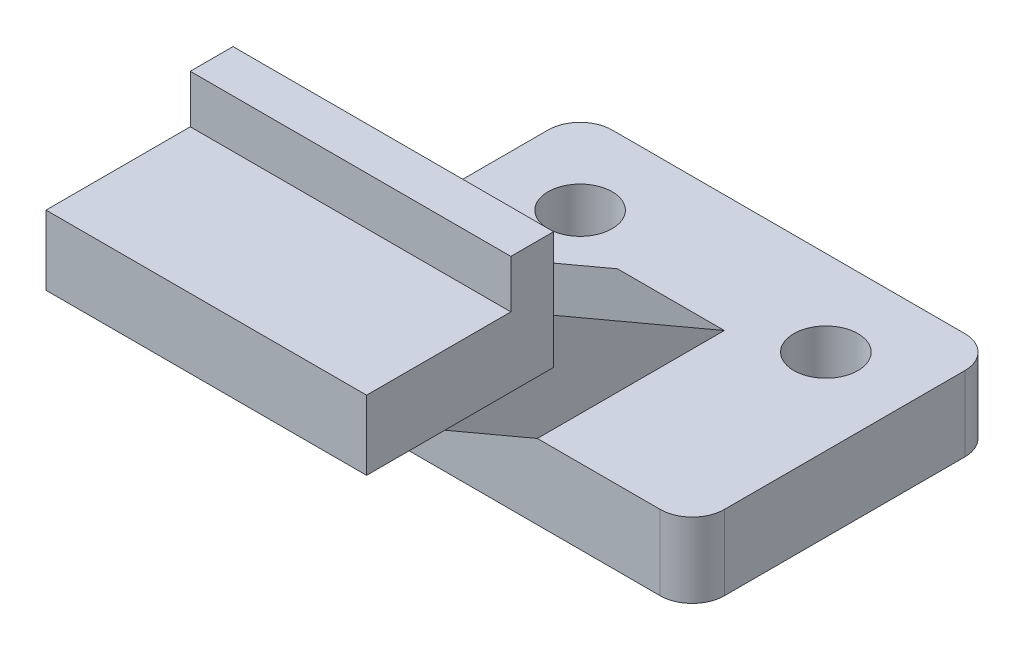
ISO-10303-21;
HEADER;
FILE_DESCRIPTION(('STEP AP214'),'2;1');
FILE_NAME('part.step','',(''),(''),'','','');
FILE_SCHEMA(('AUTOMOTIVE_DESIGN { 1 0 10303 214 1 1 1 1 }'));
ENDSEC;
DATA;
#1=APPLICATION_CONTEXT('core data for automotive mechanical design processes');
#2=APPLICATION_PROTOCOL_DEFINITION('international standard','automotive_design',2000,#1);
#3=PRODUCT_CONTEXT('',#1,'mechanical');
#4=PRODUCT('Part','Part','',(#3));
#5=PRODUCT_RELATED_PRODUCT_CATEGORY('part','',(#4));
#6=PRODUCT_DEFINITION_FORMATION('','',#4);
#7=PRODUCT_DEFINITION_CONTEXT('part definition',#1,'design');
#8=PRODUCT_DEFINITION('design','',#6,#7);
#9=PRODUCT_DEFINITION_SHAPE('','',#8);
#10=(LENGTH_UNIT() NAMED_UNIT(*) SI_UNIT(.MILLI.,.METRE.));
#11=(NAMED_UNIT(*) PLANE_ANGLE_UNIT() SI_UNIT($,.RADIAN.));
#12=(NAMED_UNIT(*) SI_UNIT($,.STERADIAN.) SOLID_ANGLE_UNIT());
#13=UNCERTAINTY_MEASURE_WITH_UNIT(LENGTH_MEASURE(1.E-05),#10,'distance_accuracy_value','');
#14=(GEOMETRIC_REPRESENTATION_CONTEXT(3) GLOBAL_UNCERTAINTY_ASSIGNED_CONTEXT((#13)) GLOBAL_UNIT_ASSIGNED_CONTEXT((#10,
#11,#12)) REPRESENTATION_CONTEXT('',''));
#15=CARTESIAN_POINT('',(0.,0.,0.));
#16=DIRECTION('',(0.,0.,1.));
#17=DIRECTION('',(1.,0.,0.));
#18=AXIS2_PLACEMENT_3D('',#15,#16,#17);
#19=CARTESIAN_POINT('',(-78.,57.,108.961524227066));
#20=DIRECTION('',(0.,0.,1.));
#21=DIRECTION('',(1.,0.,0.));
#22=AXIS2_PLACEMENT_3D('',#19,#20,#21);
#23=PLANE('',#22);
#24=DIRECTION('',(0.,-1.,0.));
#25=VECTOR('',#24,1.);
#26=CARTESIAN_POINT('',(-9.,44.,108.961524227066));
#27=LINE('',#26,#25);
#28=CARTESIAN_POINT('',(-9.,57.,108.961524227066));
#29=VERTEX_POINT('',#28);
#30=CARTESIAN_POINT('',(-9.00000000000001,44.,108.961524227066));
#31=VERTEX_POINT('',#30);
#32=EDGE_CURVE('E168',#29,#31,#27,.T.);
#33=ORIENTED_EDGE('',*,*,#32,.F.);
#34=DIRECTION('',(1.,0.,0.));
#35=VECTOR('',#34,1.);
#36=CARTESIAN_POINT('',(-78.,57.,108.961524227066));
#37=LINE('',#36,#35);
#38=CARTESIAN_POINT('',(-69.,57.,108.961524227066));
#39=VERTEX_POINT('',#38);
#40=EDGE_CURVE('E228',#39,#29,#37,.T.);
#41=ORIENTED_EDGE('',*,*,#40,.F.);
#42=DIRECTION('',(0.,1.,0.));
#43=VECTOR('',#42,1.);
#44=CARTESIAN_POINT('',(-69.,66.,108.961524227066));
#45=LINE('',#44,#43);
#46=CARTESIAN_POINT('',(-69.,44.,108.961524227066));
#47=VERTEX_POINT('',#46);
#48=EDGE_CURVE('E609',#47,#39,#45,.T.);
#49=ORIENTED_EDGE('',*,*,#48,.F.);
#50=DIRECTION('',(1.,0.,0.));
#51=VECTOR('',#50,1.);
#52=CARTESIAN_POINT('',(-78.,44.,108.961524227066));
#53=LINE('',#52,#51);
#54=CARTESIAN_POINT('',(-49.,44.,108.961524227066));
#55=VERTEX_POINT('',#54);
#56=EDGE_CURVE('E225',#47,#55,#53,.T.);
#57=ORIENTED_EDGE('',*,*,#56,.T.);
#58=CARTESIAN_POINT('',(-29.,44.,108.961524227066));
#59=VERTEX_POINT('',#58);
#60=EDGE_CURVE('E227',#55,#59,#53,.T.);
#61=ORIENTED_EDGE('',*,*,#60,.T.);
#62=DIRECTION('',(1.,0.,0.));
#63=VECTOR('',#62,1.);
#64=CARTESIAN_POINT('',(-29.,44.,108.961524227066));
#65=LINE('',#64,#63);
#66=EDGE_CURVE('E190',#59,#31,#65,.T.);
#67=ORIENTED_EDGE('',*,*,#66,.T.);
#68=EDGE_LOOP('',(#33,#41,#49,#57,#61,#67));
#69=FACE_BOUND('',#68,.T.);
#70=ADVANCED_FACE('F37',(#69),#23,.T.);
#71=CARTESIAN_POINT('',(-78.,57.,81.9615242270662));
#72=DIRECTION('',(0.,1.,0.));
#73=DIRECTION('',(0.,0.,1.));
#74=AXIS2_PLACEMENT_3D('',#71,#72,#73);
#75=PLANE('',#74);
#76=DIRECTION('',(0.,0.,1.));
#77=VECTOR('',#76,1.);
#78=CARTESIAN_POINT('',(-8.99999999999999,57.,81.9615242270662));
#79=LINE('',#78,#77);
#80=CARTESIAN_POINT('',(-8.99999999999999,57.,81.9615242270662));
#81=VERTEX_POINT('',#80);
#82=EDGE_CURVE('E603',#81,#29,#79,.T.);
#83=ORIENTED_EDGE('',*,*,#82,.F.);
#84=DIRECTION('',(1.,0.,0.));
#85=VECTOR('',#84,1.);
#86=CARTESIAN_POINT('',(-78.,57.,81.9615242270662));
#87=LINE('',#86,#85);
#88=CARTESIAN_POINT('',(-69.,57.,81.9615242270662));
#89=VERTEX_POINT('',#88);
#90=EDGE_CURVE('E231',#89,#81,#87,.T.);
#91=ORIENTED_EDGE('',*,*,#90,.F.);
#92=DIRECTION('',(0.,0.,1.));
#93=VECTOR('',#92,1.);
#94=CARTESIAN_POINT('',(-69.,57.,81.9615242270662));
#95=LINE('',#94,#93);
#96=EDGE_CURVE('E616',#89,#39,#95,.T.);
#97=ORIENTED_EDGE('',*,*,#96,.T.);
#98=ORIENTED_EDGE('',*,*,#40,.T.);
#99=EDGE_LOOP('',(#83,#91,#97,#98));
#100=FACE_BOUND('',#99,.T.);
#101=ADVANCED_FACE('F311',(#100),#75,.T.);
#102=CARTESIAN_POINT('',(-78.,66.,81.9615242270662));
#103=DIRECTION('',(0.,0.,1.));
#104=DIRECTION('',(1.,0.,0.));
#105=AXIS2_PLACEMENT_3D('',#102,#103,#104);
#106=PLANE('',#105);
#107=DIRECTION('',(0.,-1.,0.));
#108=VECTOR('',#107,1.);
#109=CARTESIAN_POINT('',(-8.99999999999999,66.,81.9615242270662));
#110=LINE('',#109,#108);
#111=CARTESIAN_POINT('',(-9.,66.,81.9615242270662));
#112=VERTEX_POINT('',#111);
#113=EDGE_CURVE('E601',#112,#81,#110,.T.);
#114=ORIENTED_EDGE('',*,*,#113,.F.);
#115=DIRECTION('',(1.,0.,0.));
#116=VECTOR('',#115,1.);
#117=CARTESIAN_POINT('',(-78.,66.,81.9615242270662));
#118=LINE('',#117,#116);
#119=CARTESIAN_POINT('',(-69.,66.,81.9615242270662));
#120=VERTEX_POINT('',#119);
#121=EDGE_CURVE('E234',#120,#112,#118,.T.);
#122=ORIENTED_EDGE('',*,*,#121,.F.);
#123=DIRECTION('',(0.,-1.,0.));
#124=VECTOR('',#123,1.);
#125=CARTESIAN_POINT('',(-69.,66.,81.9615242270662));
#126=LINE('',#125,#124);
#127=EDGE_CURVE('E613',#120,#89,#126,.T.);
#128=ORIENTED_EDGE('',*,*,#127,.T.);
#129=ORIENTED_EDGE('',*,*,#90,.T.);
#130=EDGE_LOOP('',(#114,#122,#128,#129));
#131=FACE_BOUND('',#130,.T.);
#132=ADVANCED_FACE('F317',(#131),#106,.T.);
#133=CARTESIAN_POINT('',(-78.,66.,73.9615242270662));
#134=DIRECTION('',(0.,1.,0.));
#135=DIRECTION('',(0.,0.,1.));
#136=AXIS2_PLACEMENT_3D('',#133,#134,#135);
#137=PLANE('',#136);
#138=DIRECTION('',(0.,0.,1.));
#139=VECTOR('',#138,1.);
#140=CARTESIAN_POINT('',(-9.,66.,108.961524227066));
#141=LINE('',#140,#139);
#142=CARTESIAN_POINT('',(-9.,66.,73.9615242270662));
#143=VERTEX_POINT('',#142);
#144=EDGE_CURVE('E183',#143,#112,#141,.T.);
#145=ORIENTED_EDGE('',*,*,#144,.F.);
#146=DIRECTION('',(1.,0.,0.));
#147=VECTOR('',#146,1.);
#148=CARTESIAN_POINT('',(-78.,66.,73.9615242270662));
#149=LINE('',#148,#147);
#150=CARTESIAN_POINT('',(-69.,66.,73.9615242270662));
#151=VERTEX_POINT('',#150);
#152=EDGE_CURVE('E182',#151,#143,#149,.T.);
#153=ORIENTED_EDGE('',*,*,#152,.F.);
#154=DIRECTION('',(0.,0.,-1.));
#155=VECTOR('',#154,1.);
#156=CARTESIAN_POINT('',(-69.,66.,73.9615242270662));
#157=LINE('',#156,#155);
#158=EDGE_CURVE('E611',#120,#151,#157,.T.);
#159=ORIENTED_EDGE('',*,*,#158,.F.);
#160=ORIENTED_EDGE('',*,*,#121,.T.);
#161=EDGE_LOOP('',(#145,#153,#159,#160));
#162=FACE_BOUND('',#161,.T.);
#163=ADVANCED_FACE('F326',(#162),#137,.T.);
#164=CARTESIAN_POINT('',(-78.,44.,73.9615242270662));
#165=DIRECTION('',(0.,0.,-1.));
#166=DIRECTION('',(-1.,0.,0.));
#167=AXIS2_PLACEMENT_3D('',#164,#165,#166);
#168=PLANE('',#167);
#169=DIRECTION('',(0.,1.,0.));
#170=VECTOR('',#169,1.);
#171=CARTESIAN_POINT('',(-9.,44.,73.9615242270662));
#172=LINE('',#171,#170);
#173=CARTESIAN_POINT('',(-9.,44.,73.9615242270662));
#174=VERTEX_POINT('',#173);
#175=EDGE_CURVE('E165',#174,#143,#172,.T.);
#176=ORIENTED_EDGE('',*,*,#175,.F.);
#177=DIRECTION('',(1.,0.,0.));
#178=VECTOR('',#177,1.);
#179=CARTESIAN_POINT('',(-29.,44.,73.9615242270662));
#180=LINE('',#179,#178);
#181=CARTESIAN_POINT('',(-29.,44.,73.9615242270662));
#182=VERTEX_POINT('',#181);
#183=EDGE_CURVE('E179',#182,#174,#180,.T.);
#184=ORIENTED_EDGE('',*,*,#183,.F.);
#185=DIRECTION('',(1.,0.,0.));
#186=VECTOR('',#185,1.);
#187=CARTESIAN_POINT('',(-78.,44.,73.9615242270662));
#188=LINE('',#187,#186);
#189=CARTESIAN_POINT('',(-49.,44.,73.9615242270662));
#190=VERTEX_POINT('',#189);
#191=EDGE_CURVE('E240',#190,#182,#188,.T.);
#192=ORIENTED_EDGE('',*,*,#191,.F.);
#193=CARTESIAN_POINT('',(-69.,44.,73.9615242270662));
#194=VERTEX_POINT('',#193);
#195=EDGE_CURVE('E238',#194,#190,#188,.T.);
#196=ORIENTED_EDGE('',*,*,#195,.F.);
#197=DIRECTION('',(0.,-1.,0.));
#198=VECTOR('',#197,1.);
#199=CARTESIAN_POINT('',(-69.,66.,73.9615242270662));
#200=LINE('',#199,#198);
#201=EDGE_CURVE('E605',#151,#194,#200,.T.);
#202=ORIENTED_EDGE('',*,*,#201,.F.);
#203=ORIENTED_EDGE('',*,*,#152,.T.);
#204=EDGE_LOOP('',(#176,#184,#192,#196,#202,#203));
#205=FACE_BOUND('',#204,.T.);
#206=ADVANCED_FACE('F177',(#205),#168,.T.);
#207=CARTESIAN_POINT('',(-49.,44.,73.9615242270662));
#208=DIRECTION('',(0.,1.,0.));
#209=DIRECTION('',(0.,0.,1.));
#210=AXIS2_PLACEMENT_3D('',#207,#208,#209);
#211=PLANE('',#210);
#212=DIRECTION('',(0.,0.,1.));
#213=VECTOR('',#212,1.);
#214=CARTESIAN_POINT('',(-69.,44.,73.9615242270662));
#215=LINE('',#214,#213);
#216=EDGE_CURVE('E607',#194,#47,#215,.T.);
#217=ORIENTED_EDGE('',*,*,#216,.F.);
#218=ORIENTED_EDGE('',*,*,#195,.T.);
#219=DIRECTION('',(0.,0.,-1.));
#220=VECTOR('',#219,1.);
#221=CARTESIAN_POINT('',(-49.,44.,73.9615242270662));
#222=LINE('',#221,#220);
#223=EDGE_CURVE('E622',#55,#190,#222,.T.);
#224=ORIENTED_EDGE('',*,*,#223,.F.);
#225=ORIENTED_EDGE('',*,*,#56,.F.);
#226=EDGE_LOOP('',(#217,#218,#224,#225));
#227=FACE_BOUND('',#226,.T.);
#228=ADVANCED_FACE('F333',(#227),#211,.F.);
#229=CARTESIAN_POINT('',(-78.,0.,0.));
#230=DIRECTION('',(-1.,0.,0.));
#231=DIRECTION('',(0.,0.,1.));
#232=AXIS2_PLACEMENT_3D('',#229,#230,#231);
#233=PLANE('',#232);
#234=DIRECTION('',(0.,0.,1.));
#235=VECTOR('',#234,1.);
#236=CARTESIAN_POINT('',(-78.,14.,0.));
#237=LINE('',#236,#235);
#238=CARTESIAN_POINT('',(-78.,14.,6.));
#239=VERTEX_POINT('',#238);
#240=CARTESIAN_POINT('',(-78.,14.,51.));
#241=VERTEX_POINT('',#240);
#242=EDGE_CURVE('E200',#239,#241,#237,.T.);
#243=ORIENTED_EDGE('',*,*,#242,.F.);
#244=DIRECTION('',(0.,1.,0.));
#245=VECTOR('',#244,1.);
#246=CARTESIAN_POINT('',(-78.,0.,6.));
#247=LINE('',#246,#245);
#248=CARTESIAN_POINT('',(-78.,0.,6.));
#249=VERTEX_POINT('',#248);
#250=EDGE_CURVE('E257',#239,#249,#247,.F.);
#251=ORIENTED_EDGE('',*,*,#250,.T.);
#252=DIRECTION('',(0.,0.,-1.));
#253=VECTOR('',#252,1.);
#254=CARTESIAN_POINT('',(-78.,0.,57.));
#255=LINE('',#254,#253);
#256=CARTESIAN_POINT('',(-78.,0.,51.));
#257=VERTEX_POINT('',#256);
#258=EDGE_CURVE('E203',#257,#249,#255,.T.);
#259=ORIENTED_EDGE('',*,*,#258,.F.);
#260=DIRECTION('',(0.,1.,0.));
#261=VECTOR('',#260,1.);
#262=CARTESIAN_POINT('',(-78.,14.,51.));
#263=LINE('',#262,#261);
#264=EDGE_CURVE('E254',#257,#241,#263,.T.);
#265=ORIENTED_EDGE('',*,*,#264,.T.);
#266=EDGE_LOOP('',(#243,#251,#259,#265));
#267=FACE_BOUND('',#266,.T.);
#268=ADVANCED_FACE('F296',(#267),#233,.T.);
#269=CARTESIAN_POINT('',(0.,0.,0.));
#270=DIRECTION('',(-1.,0.,0.));
#271=DIRECTION('',(0.,0.,1.));
#272=AXIS2_PLACEMENT_3D('',#269,#270,#271);
#273=PLANE('',#272);
#274=DIRECTION('',(0.,0.,1.));
#275=VECTOR('',#274,1.);
#276=CARTESIAN_POINT('',(0.,14.,0.));
#277=LINE('',#276,#275);
#278=CARTESIAN_POINT('',(0.,14.,6.));
#279=VERTEX_POINT('',#278);
#280=CARTESIAN_POINT('',(0.,14.,51.));
#281=VERTEX_POINT('',#280);
#282=EDGE_CURVE('E208',#279,#281,#277,.T.);
#283=ORIENTED_EDGE('',*,*,#282,.T.);
#284=DIRECTION('',(0.,1.,0.));
#285=VECTOR('',#284,1.);
#286=CARTESIAN_POINT('',(0.,0.,51.));
#287=LINE('',#286,#285);
#288=CARTESIAN_POINT('',(0.,0.,51.));
#289=VERTEX_POINT('',#288);
#290=EDGE_CURVE('E11',#281,#289,#287,.F.);
#291=ORIENTED_EDGE('',*,*,#290,.T.);
#292=DIRECTION('',(0.,0.,-1.));
#293=VECTOR('',#292,1.);
#294=CARTESIAN_POINT('',(0.,0.,57.));
#295=LINE('',#294,#293);
#296=CARTESIAN_POINT('',(0.,0.,6.));
#297=VERTEX_POINT('',#296);
#298=EDGE_CURVE('E204',#289,#297,#295,.T.);
#299=ORIENTED_EDGE('',*,*,#298,.T.);
#300=DIRECTION('',(0.,1.,0.));
#301=VECTOR('',#300,1.);
#302=CARTESIAN_POINT('',(0.,14.,6.));
#303=LINE('',#302,#301);
#304=EDGE_CURVE('E45',#297,#279,#303,.T.);
#305=ORIENTED_EDGE('',*,*,#304,.T.);
#306=EDGE_LOOP('',(#283,#291,#299,#305));
#307=FACE_BOUND('',#306,.T.);
#308=ADVANCED_FACE('F273',(#307),#273,.F.);
#309=CARTESIAN_POINT('',(-78.,14.,0.));
#310=DIRECTION('',(0.,1.,0.));
#311=DIRECTION('',(0.,0.,1.));
#312=AXIS2_PLACEMENT_3D('',#309,#310,#311);
#313=PLANE('',#312);
#314=CARTESIAN_POINT('',(-16.,14.,16.));
#315=DIRECTION('',(0.,1.,0.));
#316=DIRECTION('',(0.,0.,1.));
#317=AXIS2_PLACEMENT_3D('',#314,#315,#316);
#318=CIRCLE('',#317,6.);
#319=CARTESIAN_POINT('',(-16.,14.,22.));
#320=VERTEX_POINT('',#319);
#321=EDGE_CURVE('E595',#320,#320,#318,.T.);
#322=ORIENTED_EDGE('',*,*,#321,.F.);
#323=EDGE_LOOP('',(#322));
#324=FACE_BOUND('',#323,.T.);
#325=CARTESIAN_POINT('',(-62.,14.,16.));
#326=DIRECTION('',(0.,1.,0.));
#327=DIRECTION('',(0.,0.,1.));
#328=AXIS2_PLACEMENT_3D('',#325,#326,#327);
#329=CIRCLE('',#328,6.);
#330=CARTESIAN_POINT('',(-62.,14.,22.));
#331=VERTEX_POINT('',#330);
#332=EDGE_CURVE('E592',#331,#331,#329,.T.);
#333=ORIENTED_EDGE('',*,*,#332,.F.);
#334=EDGE_LOOP('',(#333));
#335=FACE_BOUND('',#334,.T.);
#336=DIRECTION('',(1.,0.,0.));
#337=VECTOR('',#336,1.);
#338=CARTESIAN_POINT('',(-78.,14.,0.));
#339=LINE('',#338,#337);
#340=CARTESIAN_POINT('',(-72.,14.,0.));
#341=VERTEX_POINT('',#340);
#342=CARTESIAN_POINT('',(-6.00000000000001,14.,0.));
#343=VERTEX_POINT('',#342);
#344=EDGE_CURVE('E213',#341,#343,#339,.T.);
#345=ORIENTED_EDGE('',*,*,#344,.F.);
#346=CARTESIAN_POINT('',(-72.,14.,6.));
#347=DIRECTION('',(0.,1.,0.));
#348=DIRECTION('',(0.,0.,1.));
#349=AXIS2_PLACEMENT_3D('',#346,#347,#348);
#350=CIRCLE('',#349,6.);
#351=EDGE_CURVE('E252',#341,#239,#350,.T.);
#352=ORIENTED_EDGE('',*,*,#351,.T.);
#353=ORIENTED_EDGE('',*,*,#242,.T.);
#354=CARTESIAN_POINT('',(-72.,14.,51.));
#355=DIRECTION('',(0.,1.,0.));
#356=DIRECTION('',(0.,0.,1.));
#357=AXIS2_PLACEMENT_3D('',#354,#355,#356);
#358=CIRCLE('',#357,6.);
#359=CARTESIAN_POINT('',(-72.,14.,57.));
#360=VERTEX_POINT('',#359);
#361=EDGE_CURVE('E250',#241,#360,#358,.T.);
#362=ORIENTED_EDGE('',*,*,#361,.T.);
#363=DIRECTION('',(1.,0.,0.));
#364=VECTOR('',#363,1.);
#365=CARTESIAN_POINT('',(-78.,14.,57.));
#366=LINE('',#365,#364);
#367=CARTESIAN_POINT('',(-49.,14.,57.));
#368=VERTEX_POINT('',#367);
#369=EDGE_CURVE('E222',#360,#368,#366,.T.);
#370=ORIENTED_EDGE('',*,*,#369,.T.);
#371=DIRECTION('',(0.,0.,1.));
#372=VECTOR('',#371,1.);
#373=CARTESIAN_POINT('',(-49.,14.,57.));
#374=LINE('',#373,#372);
#375=CARTESIAN_POINT('',(-49.,14.,22.0000000000002));
#376=VERTEX_POINT('',#375);
#377=EDGE_CURVE('E627',#376,#368,#374,.T.);
#378=ORIENTED_EDGE('',*,*,#377,.F.);
#379=DIRECTION('',(1.,0.,0.));
#380=VECTOR('',#379,1.);
#381=CARTESIAN_POINT('',(-78.,14.,22.));
#382=LINE('',#381,#380);
#383=CARTESIAN_POINT('',(-29.,14.,22.));
#384=VERTEX_POINT('',#383);
#385=EDGE_CURVE('E207',#376,#384,#382,.T.);
#386=ORIENTED_EDGE('',*,*,#385,.T.);
#387=DIRECTION('',(0.,0.,-1.));
#388=VECTOR('',#387,1.);
#389=CARTESIAN_POINT('',(-29.,14.,22.));
#390=LINE('',#389,#388);
#391=CARTESIAN_POINT('',(-29.,14.,57.));
#392=VERTEX_POINT('',#391);
#393=EDGE_CURVE('E191',#392,#384,#390,.T.);
#394=ORIENTED_EDGE('',*,*,#393,.F.);
#395=DIRECTION('',(1.,0.,0.));
#396=VECTOR('',#395,1.);
#397=CARTESIAN_POINT('',(-29.,14.,57.));
#398=LINE('',#397,#396);
#399=CARTESIAN_POINT('',(-6.00000000000001,14.,57.));
#400=VERTEX_POINT('',#399);
#401=EDGE_CURVE('E193',#392,#400,#398,.T.);
#402=ORIENTED_EDGE('',*,*,#401,.T.);
#403=CARTESIAN_POINT('',(-6.00000000000001,14.,51.));
#404=DIRECTION('',(0.,1.,0.));
#405=DIRECTION('',(0.,0.,1.));
#406=AXIS2_PLACEMENT_3D('',#403,#404,#405);
#407=CIRCLE('',#406,6.);
#408=EDGE_CURVE('E248',#400,#281,#407,.T.);
#409=ORIENTED_EDGE('',*,*,#408,.T.);
#410=ORIENTED_EDGE('',*,*,#282,.F.);
#411=CARTESIAN_POINT('',(-6.,14.,6.));
#412=DIRECTION('',(0.,1.,0.));
#413=DIRECTION('',(0.,0.,1.));
#414=AXIS2_PLACEMENT_3D('',#411,#412,#413);
#415=CIRCLE('',#414,6.);
#416=EDGE_CURVE('E246',#279,#343,#415,.T.);
#417=ORIENTED_EDGE('',*,*,#416,.T.);
#418=EDGE_LOOP('',(#345,#352,#353,#362,#370,#378,#386,#394,#402,#409,#410,#417));
#419=FACE_BOUND('',#418,.T.);
#420=ADVANCED_FACE('F279',(#324,#335,#419),#313,.T.);
#421=CARTESIAN_POINT('',(-78.,0.,0.));
#422=DIRECTION('',(0.,0.,-1.));
#423=DIRECTION('',(-1.,0.,0.));
#424=AXIS2_PLACEMENT_3D('',#421,#422,#423);
#425=PLANE('',#424);
#426=DIRECTION('',(1.,0.,0.));
#427=VECTOR('',#426,1.);
#428=CARTESIAN_POINT('',(-78.,0.,0.));
#429=LINE('',#428,#427);
#430=CARTESIAN_POINT('',(-72.,0.,0.));
#431=VERTEX_POINT('',#430);
#432=CARTESIAN_POINT('',(-6.00000000000001,0.,0.));
#433=VERTEX_POINT('',#432);
#434=EDGE_CURVE('E217',#431,#433,#429,.T.);
#435=ORIENTED_EDGE('',*,*,#434,.F.);
#436=DIRECTION('',(0.,1.,0.));
#437=VECTOR('',#436,1.);
#438=CARTESIAN_POINT('',(-72.,0.,0.));
#439=LINE('',#438,#437);
#440=EDGE_CURVE('E243',#431,#341,#439,.T.);
#441=ORIENTED_EDGE('',*,*,#440,.T.);
#442=ORIENTED_EDGE('',*,*,#344,.T.);
#443=DIRECTION('',(0.,1.,0.));
#444=VECTOR('',#443,1.);
#445=CARTESIAN_POINT('',(-6.,0.,0.));
#446=LINE('',#445,#444);
#447=EDGE_CURVE('E216',#343,#433,#446,.F.);
#448=ORIENTED_EDGE('',*,*,#447,.T.);
#449=EDGE_LOOP('',(#435,#441,#442,#448));
#450=FACE_BOUND('',#449,.T.);
#451=ADVANCED_FACE('F304',(#450),#425,.T.);
#452=CARTESIAN_POINT('',(-78.,0.,57.));
#453=DIRECTION('',(0.,-1.,0.));
#454=DIRECTION('',(0.,0.,-1.));
#455=AXIS2_PLACEMENT_3D('',#452,#453,#454);
#456=PLANE('',#455);
#457=CARTESIAN_POINT('',(-16.,0.,16.));
#458=DIRECTION('',(0.,1.,0.));
#459=DIRECTION('',(0.,0.,1.));
#460=AXIS2_PLACEMENT_3D('',#457,#458,#459);
#461=CIRCLE('',#460,6.);
#462=CARTESIAN_POINT('',(-16.,0.,22.));
#463=VERTEX_POINT('',#462);
#464=EDGE_CURVE('E588',#463,#463,#461,.T.);
#465=ORIENTED_EDGE('',*,*,#464,.T.);
#466=EDGE_LOOP('',(#465));
#467=FACE_BOUND('',#466,.T.);
#468=CARTESIAN_POINT('',(-62.,0.,16.));
#469=DIRECTION('',(0.,1.,0.));
#470=DIRECTION('',(0.,0.,1.));
#471=AXIS2_PLACEMENT_3D('',#468,#469,#470);
#472=CIRCLE('',#471,6.);
#473=CARTESIAN_POINT('',(-62.,0.,22.));
#474=VERTEX_POINT('',#473);
#475=EDGE_CURVE('E591',#474,#474,#472,.T.);
#476=ORIENTED_EDGE('',*,*,#475,.T.);
#477=EDGE_LOOP('',(#476));
#478=FACE_BOUND('',#477,.T.);
#479=ORIENTED_EDGE('',*,*,#258,.T.);
#480=CARTESIAN_POINT('',(-72.,0.,6.));
#481=DIRECTION('',(0.,-1.,0.));
#482=DIRECTION('',(0.,0.,-1.));
#483=AXIS2_PLACEMENT_3D('',#480,#481,#482);
#484=CIRCLE('',#483,6.);
#485=EDGE_CURVE('E264',#249,#431,#484,.T.);
#486=ORIENTED_EDGE('',*,*,#485,.T.);
#487=ORIENTED_EDGE('',*,*,#434,.T.);
#488=CARTESIAN_POINT('',(-6.,0.,6.));
#489=DIRECTION('',(0.,-1.,0.));
#490=DIRECTION('',(0.,0.,-1.));
#491=AXIS2_PLACEMENT_3D('',#488,#489,#490);
#492=CIRCLE('',#491,6.);
#493=EDGE_CURVE('E259',#433,#297,#492,.T.);
#494=ORIENTED_EDGE('',*,*,#493,.T.);
#495=ORIENTED_EDGE('',*,*,#298,.F.);
#496=CARTESIAN_POINT('',(-6.00000000000001,0.,51.));
#497=DIRECTION('',(0.,-1.,0.));
#498=DIRECTION('',(0.,0.,-1.));
#499=AXIS2_PLACEMENT_3D('',#496,#497,#498);
#500=CIRCLE('',#499,6.);
#501=CARTESIAN_POINT('',(-6.00000000000001,0.,57.));
#502=VERTEX_POINT('',#501);
#503=EDGE_CURVE('E52',#289,#502,#500,.T.);
#504=ORIENTED_EDGE('',*,*,#503,.T.);
#505=DIRECTION('',(1.,0.,0.));
#506=VECTOR('',#505,1.);
#507=CARTESIAN_POINT('',(-78.,0.,57.));
#508=LINE('',#507,#506);
#509=CARTESIAN_POINT('',(-72.,0.,57.));
#510=VERTEX_POINT('',#509);
#511=EDGE_CURVE('E220',#510,#502,#508,.T.);
#512=ORIENTED_EDGE('',*,*,#511,.F.);
#513=CARTESIAN_POINT('',(-72.,0.,51.));
#514=DIRECTION('',(0.,-1.,0.));
#515=DIRECTION('',(0.,0.,-1.));
#516=AXIS2_PLACEMENT_3D('',#513,#514,#515);
#517=CIRCLE('',#516,6.);
#518=EDGE_CURVE('E262',#510,#257,#517,.T.);
#519=ORIENTED_EDGE('',*,*,#518,.T.);
#520=EDGE_LOOP('',(#479,#486,#487,#494,#495,#504,#512,#519));
#521=FACE_BOUND('',#520,.T.);
#522=ADVANCED_FACE('F289',(#467,#478,#521),#456,.T.);
#523=CARTESIAN_POINT('',(-78.,0.,57.));
#524=DIRECTION('',(0.,0.,-1.));
#525=DIRECTION('',(-1.,0.,0.));
#526=AXIS2_PLACEMENT_3D('',#523,#524,#525);
#527=PLANE('',#526);
#528=ORIENTED_EDGE('',*,*,#369,.F.);
#529=DIRECTION('',(0.,1.,0.));
#530=VECTOR('',#529,1.);
#531=CARTESIAN_POINT('',(-72.,0.,57.));
#532=LINE('',#531,#530);
#533=EDGE_CURVE('E59',#360,#510,#532,.F.);
#534=ORIENTED_EDGE('',*,*,#533,.T.);
#535=ORIENTED_EDGE('',*,*,#511,.T.);
#536=DIRECTION('',(0.,1.,0.));
#537=VECTOR('',#536,1.);
#538=CARTESIAN_POINT('',(-6.00000000000001,0.,57.));
#539=LINE('',#538,#537);
#540=EDGE_CURVE('E266',#502,#400,#539,.T.);
#541=ORIENTED_EDGE('',*,*,#540,.T.);
#542=ORIENTED_EDGE('',*,*,#401,.F.);
#543=EDGE_CURVE('E224',#368,#392,#366,.T.);
#544=ORIENTED_EDGE('',*,*,#543,.F.);
#545=EDGE_LOOP('',(#528,#534,#535,#541,#542,#544));
#546=FACE_BOUND('',#545,.T.);
#547=ADVANCED_FACE('F286',(#546),#527,.F.);
#548=CARTESIAN_POINT('',(-78.,14.,57.));
#549=DIRECTION('',(0.,0.866025403784438,-0.500000000000001));
#550=DIRECTION('',(0.,0.500000000000001,0.866025403784438));
#551=AXIS2_PLACEMENT_3D('',#548,#549,#550);
#552=PLANE('',#551);
#553=ORIENTED_EDGE('',*,*,#60,.F.);
#554=DIRECTION('',(0.,0.500000000000001,0.866025403784438));
#555=VECTOR('',#554,1.);
#556=CARTESIAN_POINT('',(-49.,44.,108.961524227066));
#557=LINE('',#556,#555);
#558=EDGE_CURVE('E619',#368,#55,#557,.T.);
#559=ORIENTED_EDGE('',*,*,#558,.F.);
#560=ORIENTED_EDGE('',*,*,#543,.T.);
#561=DIRECTION('',(0.,-0.500000000000001,-0.866025403784438));
#562=VECTOR('',#561,1.);
#563=CARTESIAN_POINT('',(-29.,14.,57.));
#564=LINE('',#563,#562);
#565=EDGE_CURVE('E196',#59,#392,#564,.T.);
#566=ORIENTED_EDGE('',*,*,#565,.F.);
#567=EDGE_LOOP('',(#553,#559,#560,#566));
#568=FACE_BOUND('',#567,.T.);
#569=ADVANCED_FACE('F321',(#568),#552,.F.);
#570=CARTESIAN_POINT('',(-78.,14.,22.));
#571=DIRECTION('',(0.,0.866025403784438,-0.500000000000001));
#572=DIRECTION('',(0.,0.500000000000001,0.866025403784438));
#573=AXIS2_PLACEMENT_3D('',#570,#571,#572);
#574=PLANE('',#573);
#575=DIRECTION('',(0.,-0.500000000000002,-0.866025403784437));
#576=VECTOR('',#575,1.);
#577=CARTESIAN_POINT('',(-49.,14.,22.0000000000002));
#578=LINE('',#577,#576);
#579=EDGE_CURVE('E625',#190,#376,#578,.T.);
#580=ORIENTED_EDGE('',*,*,#579,.F.);
#581=ORIENTED_EDGE('',*,*,#191,.T.);
#582=DIRECTION('',(0.,0.500000000000001,0.866025403784438));
#583=VECTOR('',#582,1.);
#584=CARTESIAN_POINT('',(-29.,44.,73.9615242270662));
#585=LINE('',#584,#583);
#586=EDGE_CURVE('E630',#384,#182,#585,.T.);
#587=ORIENTED_EDGE('',*,*,#586,.F.);
#588=ORIENTED_EDGE('',*,*,#385,.F.);
#589=EDGE_LOOP('',(#580,#581,#587,#588));
#590=FACE_BOUND('',#589,.T.);
#591=ADVANCED_FACE('F334',(#590),#574,.T.);
#592=CARTESIAN_POINT('',(-29.,44.,108.961524227066));
#593=DIRECTION('',(0.,1.,0.));
#594=DIRECTION('',(0.,0.,1.));
#595=AXIS2_PLACEMENT_3D('',#592,#593,#594);
#596=PLANE('',#595);
#597=ORIENTED_EDGE('',*,*,#183,.T.);
#598=DIRECTION('',(0.,0.,-1.));
#599=VECTOR('',#598,1.);
#600=CARTESIAN_POINT('',(-9.,44.,108.961524227066));
#601=LINE('',#600,#599);
#602=EDGE_CURVE('E162',#31,#174,#601,.T.);
#603=ORIENTED_EDGE('',*,*,#602,.F.);
#604=ORIENTED_EDGE('',*,*,#66,.F.);
#605=DIRECTION('',(0.,0.,1.));
#606=VECTOR('',#605,1.);
#607=CARTESIAN_POINT('',(-29.,44.,108.961524227066));
#608=LINE('',#607,#606);
#609=EDGE_CURVE('E188',#182,#59,#608,.T.);
#610=ORIENTED_EDGE('',*,*,#609,.F.);
#611=EDGE_LOOP('',(#597,#603,#604,#610));
#612=FACE_BOUND('',#611,.T.);
#613=ADVANCED_FACE('F186',(#612),#596,.F.);
#614=CARTESIAN_POINT('',(-29.,0.,0.));
#615=DIRECTION('',(-1.,0.,0.));
#616=DIRECTION('',(0.,0.,1.));
#617=AXIS2_PLACEMENT_3D('',#614,#615,#616);
#618=PLANE('',#617);
#619=ORIENTED_EDGE('',*,*,#586,.T.);
#620=ORIENTED_EDGE('',*,*,#609,.T.);
#621=ORIENTED_EDGE('',*,*,#565,.T.);
#622=ORIENTED_EDGE('',*,*,#393,.T.);
#623=EDGE_LOOP('',(#619,#620,#621,#622));
#624=FACE_BOUND('',#623,.T.);
#625=ADVANCED_FACE('F463',(#624),#618,.F.);
#626=CARTESIAN_POINT('',(-49.,0.,0.));
#627=DIRECTION('',(1.,0.,0.));
#628=DIRECTION('',(0.,0.,-1.));
#629=AXIS2_PLACEMENT_3D('',#626,#627,#628);
#630=PLANE('',#629);
#631=ORIENTED_EDGE('',*,*,#558,.T.);
#632=ORIENTED_EDGE('',*,*,#223,.T.);
#633=ORIENTED_EDGE('',*,*,#579,.T.);
#634=ORIENTED_EDGE('',*,*,#377,.T.);
#635=EDGE_LOOP('',(#631,#632,#633,#634));
#636=FACE_BOUND('',#635,.T.);
#637=ADVANCED_FACE('F407',(#636),#630,.F.);
#638=CARTESIAN_POINT('',(-69.,0.,0.));
#639=DIRECTION('',(-1.,0.,0.));
#640=DIRECTION('',(0.,0.,1.));
#641=AXIS2_PLACEMENT_3D('',#638,#639,#640);
#642=PLANE('',#641);
#643=ORIENTED_EDGE('',*,*,#127,.F.);
#644=ORIENTED_EDGE('',*,*,#158,.T.);
#645=ORIENTED_EDGE('',*,*,#201,.T.);
#646=ORIENTED_EDGE('',*,*,#216,.T.);
#647=ORIENTED_EDGE('',*,*,#48,.T.);
#648=ORIENTED_EDGE('',*,*,#96,.F.);
#649=EDGE_LOOP('',(#643,#644,#645,#646,#647,#648));
#650=FACE_BOUND('',#649,.T.);
#651=ADVANCED_FACE('F398',(#650),#642,.T.);
#652=CARTESIAN_POINT('',(-9.,0.,0.));
#653=DIRECTION('',(-1.,0.,0.));
#654=DIRECTION('',(0.,0.,1.));
#655=AXIS2_PLACEMENT_3D('',#652,#653,#654);
#656=PLANE('',#655);
#657=ORIENTED_EDGE('',*,*,#82,.T.);
#658=ORIENTED_EDGE('',*,*,#32,.T.);
#659=ORIENTED_EDGE('',*,*,#602,.T.);
#660=ORIENTED_EDGE('',*,*,#175,.T.);
#661=ORIENTED_EDGE('',*,*,#144,.T.);
#662=ORIENTED_EDGE('',*,*,#113,.T.);
#663=EDGE_LOOP('',(#657,#658,#659,#660,#661,#662));
#664=FACE_BOUND('',#663,.T.);
#665=ADVANCED_FACE('F164',(#664),#656,.F.);
#666=CARTESIAN_POINT('',(-62.,0.,16.));
#667=DIRECTION('',(0.,1.,0.));
#668=DIRECTION('',(0.,0.,1.));
#669=AXIS2_PLACEMENT_3D('',#666,#667,#668);
#670=CYLINDRICAL_SURFACE('',#669,6.);
#671=CARTESIAN_POINT('',(-62.,0.,22.));
#672=CARTESIAN_POINT('',(-62.,0.145833333333316,22.));
#673=CARTESIAN_POINT('',(-62.,0.291666666666649,22.));
#674=CARTESIAN_POINT('',(-62.,0.583333333333316,22.));
#675=CARTESIAN_POINT('',(-62.,0.72916666666665,22.));
#676=CARTESIAN_POINT('',(-62.,1.02083333333332,22.));
#677=CARTESIAN_POINT('',(-62.,1.16666666666665,22.));
#678=CARTESIAN_POINT('',(-62.,1.45833333333332,22.));
#679=CARTESIAN_POINT('',(-62.,1.60416666666665,22.));
#680=CARTESIAN_POINT('',(-62.,1.89583333333332,22.));
#681=CARTESIAN_POINT('',(-62.,2.04166666666665,22.));
#682=CARTESIAN_POINT('',(-62.,2.33333333333332,22.));
#683=CARTESIAN_POINT('',(-62.,2.47916666666665,22.));
#684=CARTESIAN_POINT('',(-62.,2.77083333333332,22.));
#685=CARTESIAN_POINT('',(-62.,2.91666666666665,22.));
#686=CARTESIAN_POINT('',(-62.,3.20833333333332,22.));
#687=CARTESIAN_POINT('',(-62.,3.35416666666665,22.));
#688=CARTESIAN_POINT('',(-62.,3.64583333333332,22.));
#689=CARTESIAN_POINT('',(-62.,3.79166666666665,22.));
#690=CARTESIAN_POINT('',(-62.,4.08333333333332,22.));
#691=CARTESIAN_POINT('',(-62.,4.22916666666665,22.));
#692=CARTESIAN_POINT('',(-62.,4.52083333333332,22.));
#693=CARTESIAN_POINT('',(-62.,4.66666666666665,22.));
#694=CARTESIAN_POINT('',(-62.,4.95833333333332,22.));
#695=CARTESIAN_POINT('',(-62.,5.10416666666665,22.));
#696=CARTESIAN_POINT('',(-62.,5.39583333333332,22.));
#697=CARTESIAN_POINT('',(-62.,5.54166666666665,22.));
#698=CARTESIAN_POINT('',(-62.,5.83333333333332,22.));
#699=CARTESIAN_POINT('',(-62.,5.97916666666665,22.));
#700=CARTESIAN_POINT('',(-62.,6.27083333333332,22.));
#701=CARTESIAN_POINT('',(-62.,6.41666666666665,22.));
#702=CARTESIAN_POINT('',(-62.,6.70833333333332,22.));
#703=CARTESIAN_POINT('',(-62.,6.85416666666665,22.));
#704=CARTESIAN_POINT('',(-62.,7.14583333333332,22.));
#705=CARTESIAN_POINT('',(-62.,7.29166666666665,22.));
#706=CARTESIAN_POINT('',(-62.,7.58333333333332,22.));
#707=CARTESIAN_POINT('',(-62.,7.72916666666666,22.));
#708=CARTESIAN_POINT('',(-62.,8.02083333333332,22.));
#709=CARTESIAN_POINT('',(-62.,8.16666666666666,22.));
#710=CARTESIAN_POINT('',(-62.,8.45833333333332,22.));
#711=CARTESIAN_POINT('',(-62.,8.60416666666666,22.));
#712=CARTESIAN_POINT('',(-62.,8.89583333333332,22.));
#713=CARTESIAN_POINT('',(-62.,9.04166666666666,22.));
#714=CARTESIAN_POINT('',(-62.,9.33333333333332,22.));
#715=CARTESIAN_POINT('',(-62.,9.47916666666666,22.));
#716=CARTESIAN_POINT('',(-62.,9.77083333333332,22.));
#717=CARTESIAN_POINT('',(-62.,9.91666666666666,22.));
#718=CARTESIAN_POINT('',(-62.,10.2083333333333,22.));
#719=CARTESIAN_POINT('',(-62.,10.3541666666667,22.));
#720=CARTESIAN_POINT('',(-62.,10.6458333333333,22.));
#721=CARTESIAN_POINT('',(-62.,10.7916666666667,22.));
#722=CARTESIAN_POINT('',(-62.,11.0833333333333,22.));
#723=CARTESIAN_POINT('',(-62.,11.2291666666667,22.));
#724=CARTESIAN_POINT('',(-62.,11.5208333333333,22.));
#725=CARTESIAN_POINT('',(-62.,11.6666666666667,22.));
#726=CARTESIAN_POINT('',(-62.,11.9583333333333,22.));
#727=CARTESIAN_POINT('',(-62.,12.1041666666667,22.));
#728=CARTESIAN_POINT('',(-62.,12.3958333333333,22.));
#729=CARTESIAN_POINT('',(-62.,12.5416666666667,22.));
#730=CARTESIAN_POINT('',(-62.,12.8333333333333,22.));
#731=CARTESIAN_POINT('',(-62.,12.9791666666667,22.));
#732=CARTESIAN_POINT('',(-62.,13.2708333333333,22.));
#733=CARTESIAN_POINT('',(-62.,13.4166666666667,22.));
#734=CARTESIAN_POINT('',(-62.,13.7083333333333,22.));
#735=CARTESIAN_POINT('',(-62.,13.8541666666667,22.));
#736=CARTESIAN_POINT('',(-62.,14.,22.));
#737=B_SPLINE_CURVE_WITH_KNOTS('',3,(#671,#672,#673,#674,#675,#676,#677,#678,#679,#680,#681,
#682,#683,#684,#685,#686,#687,#688,#689,#690,#691,#692,#693,#694,#695,#696,#697,#698,#699,#700,
#701,#702,#703,#704,#705,#706,#707,#708,#709,#710,#711,#712,#713,#714,#715,#716,#717,#718,#719,
#720,#721,#722,#723,#724,#725,#726,#727,#728,#729,#730,#731,#732,#733,#734,#735,#736),
.UNSPECIFIED.,.F.,.F.,(4,2,2,2,2,2,2,2,2,2,2,2,2,2,2,2,2,2,2,2,2,2,2,2,2,2,2,2,2,2,2,2,4),(0.,
0.4375,0.875000000000001,1.3125,1.75,2.1875,2.625,3.0625,3.5,3.9375,4.375,4.8125,5.25,
5.68750000000001,6.12500000000001,6.56250000000001,7.00000000000001,7.43750000000001,
7.87500000000001,8.31250000000001,8.75000000000001,9.18750000000001,9.62500000000001,10.0625,
10.5,10.9375,11.375,11.8125,12.25,12.6875,13.125,13.5625,14.),.UNSPECIFIED.);
#738=EDGE_CURVE('BSEAM379',#474,#331,#737,.T.);
#739=ORIENTED_EDGE('',*,*,#475,.F.);
#740=ORIENTED_EDGE('',*,*,#332,.T.);
#741=ORIENTED_EDGE('',*,*,#738,.T.);
#742=ORIENTED_EDGE('',*,*,#738,.F.);
#743=EDGE_LOOP('',(#739,#741,#740,#742));
#744=FACE_BOUND('',#743,.T.);
#745=ADVANCED_FACE('F379',(#744),#670,.F.);
#746=CARTESIAN_POINT('',(-16.,0.,16.));
#747=DIRECTION('',(0.,1.,0.));
#748=DIRECTION('',(0.,0.,1.));
#749=AXIS2_PLACEMENT_3D('',#746,#747,#748);
#750=CYLINDRICAL_SURFACE('',#749,6.);
#751=CARTESIAN_POINT('',(-16.,0.,22.));
#752=CARTESIAN_POINT('',(-16.,0.145833333333316,22.));
#753=CARTESIAN_POINT('',(-16.,0.291666666666649,22.));
#754=CARTESIAN_POINT('',(-16.,0.583333333333316,22.));
#755=CARTESIAN_POINT('',(-16.,0.72916666666665,22.));
#756=CARTESIAN_POINT('',(-16.,1.02083333333332,22.));
#757=CARTESIAN_POINT('',(-16.,1.16666666666665,22.));
#758=CARTESIAN_POINT('',(-16.,1.45833333333332,22.));
#759=CARTESIAN_POINT('',(-16.,1.60416666666665,22.));
#760=CARTESIAN_POINT('',(-16.,1.89583333333332,22.));
#761=CARTESIAN_POINT('',(-16.,2.04166666666665,22.));
#762=CARTESIAN_POINT('',(-16.,2.33333333333332,22.));
#763=CARTESIAN_POINT('',(-16.,2.47916666666665,22.));
#764=CARTESIAN_POINT('',(-16.,2.77083333333332,22.));
#765=CARTESIAN_POINT('',(-16.,2.91666666666665,22.));
#766=CARTESIAN_POINT('',(-16.,3.20833333333332,22.));
#767=CARTESIAN_POINT('',(-16.,3.35416666666665,22.));
#768=CARTESIAN_POINT('',(-16.,3.64583333333332,22.));
#769=CARTESIAN_POINT('',(-16.,3.79166666666665,22.));
#770=CARTESIAN_POINT('',(-16.,4.08333333333332,22.));
#771=CARTESIAN_POINT('',(-16.,4.22916666666665,22.));
#772=CARTESIAN_POINT('',(-16.,4.52083333333332,22.));
#773=CARTESIAN_POINT('',(-16.,4.66666666666665,22.));
#774=CARTESIAN_POINT('',(-16.,4.95833333333332,22.));
#775=CARTESIAN_POINT('',(-16.,5.10416666666665,22.));
#776=CARTESIAN_POINT('',(-16.,5.39583333333332,22.));
#777=CARTESIAN_POINT('',(-16.,5.54166666666665,22.));
#778=CARTESIAN_POINT('',(-16.,5.83333333333332,22.));
#779=CARTESIAN_POINT('',(-16.,5.97916666666665,22.));
#780=CARTESIAN_POINT('',(-16.,6.27083333333332,22.));
#781=CARTESIAN_POINT('',(-16.,6.41666666666665,22.));
#782=CARTESIAN_POINT('',(-16.,6.70833333333332,22.));
#783=CARTESIAN_POINT('',(-16.,6.85416666666665,22.));
#784=CARTESIAN_POINT('',(-16.,7.14583333333332,22.));
#785=CARTESIAN_POINT('',(-16.,7.29166666666665,22.));
#786=CARTESIAN_POINT('',(-16.,7.58333333333332,22.));
#787=CARTESIAN_POINT('',(-16.,7.72916666666666,22.));
#788=CARTESIAN_POINT('',(-16.,8.02083333333332,22.));
#789=CARTESIAN_POINT('',(-16.,8.16666666666666,22.));
#790=CARTESIAN_POINT('',(-16.,8.45833333333332,22.));
#791=CARTESIAN_POINT('',(-16.,8.60416666666666,22.));
#792=CARTESIAN_POINT('',(-16.,8.89583333333332,22.));
#793=CARTESIAN_POINT('',(-16.,9.04166666666666,22.));
#794=CARTESIAN_POINT('',(-16.,9.33333333333332,22.));
#795=CARTESIAN_POINT('',(-16.,9.47916666666666,22.));
#796=CARTESIAN_POINT('',(-16.,9.77083333333332,22.));
#797=CARTESIAN_POINT('',(-16.,9.91666666666666,22.));
#798=CARTESIAN_POINT('',(-16.,10.2083333333333,22.));
#799=CARTESIAN_POINT('',(-16.,10.3541666666667,22.));
#800=CARTESIAN_POINT('',(-16.,10.6458333333333,22.));
#801=CARTESIAN_POINT('',(-16.,10.7916666666667,22.));
#802=CARTESIAN_POINT('',(-16.,11.0833333333333,22.));
#803=CARTESIAN_POINT('',(-16.,11.2291666666667,22.));
#804=CARTESIAN_POINT('',(-16.,11.5208333333333,22.));
#805=CARTESIAN_POINT('',(-16.,11.6666666666667,22.));
#806=CARTESIAN_POINT('',(-16.,11.9583333333333,22.));
#807=CARTESIAN_POINT('',(-16.,12.1041666666667,22.));
#808=CARTESIAN_POINT('',(-16.,12.3958333333333,22.));
#809=CARTESIAN_POINT('',(-16.,12.5416666666667,22.));
#810=CARTESIAN_POINT('',(-16.,12.8333333333333,22.));
#811=CARTESIAN_POINT('',(-16.,12.9791666666667,22.));
#812=CARTESIAN_POINT('',(-16.,13.2708333333333,22.));
#813=CARTESIAN_POINT('',(-16.,13.4166666666667,22.));
#814=CARTESIAN_POINT('',(-16.,13.7083333333333,22.));
#815=CARTESIAN_POINT('',(-16.,13.8541666666667,22.));
#816=CARTESIAN_POINT('',(-16.,14.,22.));
#817=B_SPLINE_CURVE_WITH_KNOTS('',3,(#751,#752,#753,#754,#755,#756,#757,#758,#759,#760,#761,
#762,#763,#764,#765,#766,#767,#768,#769,#770,#771,#772,#773,#774,#775,#776,#777,#778,#779,#780,
#781,#782,#783,#784,#785,#786,#787,#788,#789,#790,#791,#792,#793,#794,#795,#796,#797,#798,#799,
#800,#801,#802,#803,#804,#805,#806,#807,#808,#809,#810,#811,#812,#813,#814,#815,#816),
.UNSPECIFIED.,.F.,.F.,(4,2,2,2,2,2,2,2,2,2,2,2,2,2,2,2,2,2,2,2,2,2,2,2,2,2,2,2,2,2,2,2,4),(0.,
0.4375,0.875000000000001,1.3125,1.75,2.1875,2.625,3.0625,3.5,3.9375,4.375,4.8125,5.25,
5.68750000000001,6.12500000000001,6.56250000000001,7.00000000000001,7.43750000000001,
7.87500000000001,8.31250000000001,8.75000000000001,9.18750000000001,9.62500000000001,10.0625,
10.5,10.9375,11.375,11.8125,12.25,12.6875,13.125,13.5625,14.),.UNSPECIFIED.);
#818=EDGE_CURVE('BSEAM343',#463,#320,#817,.T.);
#819=ORIENTED_EDGE('',*,*,#464,.F.);
#820=ORIENTED_EDGE('',*,*,#321,.T.);
#821=ORIENTED_EDGE('',*,*,#818,.T.);
#822=ORIENTED_EDGE('',*,*,#818,.F.);
#823=EDGE_LOOP('',(#819,#821,#820,#822));
#824=FACE_BOUND('',#823,.T.);
#825=ADVANCED_FACE('F343',(#824),#750,.F.);
#826=CARTESIAN_POINT('',(-72.,0.,6.));
#827=DIRECTION('',(0.,1.,0.));
#828=DIRECTION('',(0.,0.,1.));
#829=AXIS2_PLACEMENT_3D('',#826,#827,#828);
#830=CYLINDRICAL_SURFACE('',#829,6.);
#831=ORIENTED_EDGE('',*,*,#485,.F.);
#832=ORIENTED_EDGE('',*,*,#250,.F.);
#833=ORIENTED_EDGE('',*,*,#351,.F.);
#834=ORIENTED_EDGE('',*,*,#440,.F.);
#835=EDGE_LOOP('',(#831,#832,#833,#834));
#836=FACE_BOUND('',#835,.T.);
#837=ADVANCED_FACE('F301',(#836),#830,.T.);
#838=CARTESIAN_POINT('',(-72.,0.,51.));
#839=DIRECTION('',(0.,-1.,0.));
#840=DIRECTION('',(0.,0.,-1.));
#841=AXIS2_PLACEMENT_3D('',#838,#839,#840);
#842=CYLINDRICAL_SURFACE('',#841,6.);
#843=ORIENTED_EDGE('',*,*,#518,.F.);
#844=ORIENTED_EDGE('',*,*,#533,.F.);
#845=ORIENTED_EDGE('',*,*,#361,.F.);
#846=ORIENTED_EDGE('',*,*,#264,.F.);
#847=EDGE_LOOP('',(#843,#844,#845,#846));
#848=FACE_BOUND('',#847,.T.);
#849=ADVANCED_FACE('F293',(#848),#842,.T.);
#850=CARTESIAN_POINT('',(-6.00000000000001,0.,51.));
#851=DIRECTION('',(0.,1.,0.));
#852=DIRECTION('',(0.,0.,1.));
#853=AXIS2_PLACEMENT_3D('',#850,#851,#852);
#854=CYLINDRICAL_SURFACE('',#853,6.);
#855=ORIENTED_EDGE('',*,*,#503,.F.);
#856=ORIENTED_EDGE('',*,*,#290,.F.);
#857=ORIENTED_EDGE('',*,*,#408,.F.);
#858=ORIENTED_EDGE('',*,*,#540,.F.);
#859=EDGE_LOOP('',(#855,#856,#857,#858));
#860=FACE_BOUND('',#859,.T.);
#861=ADVANCED_FACE('F285',(#860),#854,.T.);
#862=CARTESIAN_POINT('',(-6.,0.,6.));
#863=DIRECTION('',(0.,-1.,0.));
#864=DIRECTION('',(0.,0.,-1.));
#865=AXIS2_PLACEMENT_3D('',#862,#863,#864);
#866=CYLINDRICAL_SURFACE('',#865,6.);
#867=ORIENTED_EDGE('',*,*,#493,.F.);
#868=ORIENTED_EDGE('',*,*,#447,.F.);
#869=ORIENTED_EDGE('',*,*,#416,.F.);
#870=ORIENTED_EDGE('',*,*,#304,.F.);
#871=EDGE_LOOP('',(#867,#868,#869,#870));
#872=FACE_BOUND('',#871,.T.);
#873=ADVANCED_FACE('F39',(#872),#866,.T.);
#874=CLOSED_SHELL('',(#70,#101,#132,#163,#206,#228,#268,#308,#420,#451,#522,#547,#569,#591,#613,
#625,#637,#651,#665,#745,#825,#837,#849,#861,#873));
#875=MANIFOLD_SOLID_BREP('B2',#874);
#876=ADVANCED_BREP_SHAPE_REPRESENTATION('',(#18,#875),#14);
#877=SHAPE_DEFINITION_REPRESENTATION(#9,#876);
ENDSEC;
END-ISO-10303-21;
